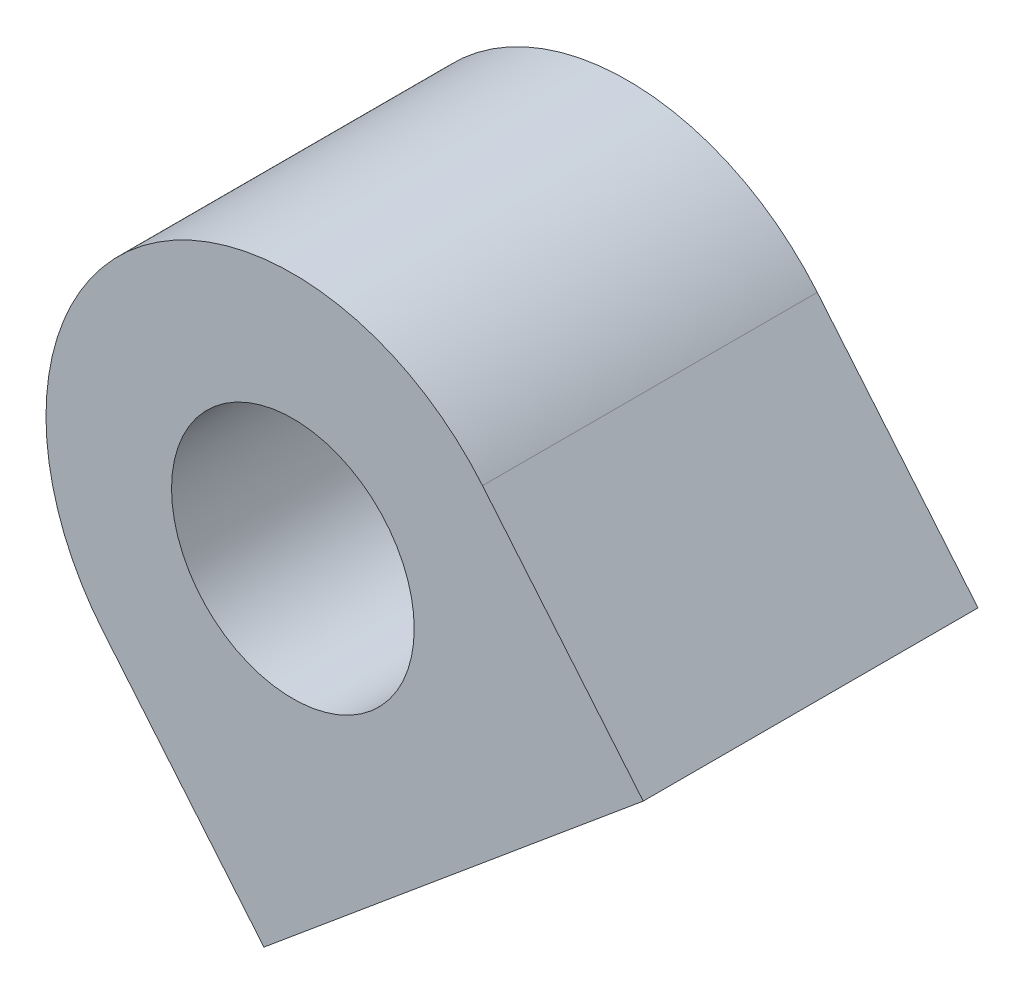
ISO-10303-21;
HEADER;
FILE_DESCRIPTION(('STEP AP214'),'2;1');
FILE_NAME('part.step','',(''),(''),'','','');
FILE_SCHEMA(('AUTOMOTIVE_DESIGN { 1 0 10303 214 1 1 1 1 }'));
ENDSEC;
DATA;
#1=APPLICATION_CONTEXT('core data for automotive mechanical design processes');
#2=APPLICATION_PROTOCOL_DEFINITION('international standard','automotive_design',2000,#1);
#3=PRODUCT_CONTEXT('',#1,'mechanical');
#4=PRODUCT('Part','Part','',(#3));
#5=PRODUCT_RELATED_PRODUCT_CATEGORY('part','',(#4));
#6=PRODUCT_DEFINITION_FORMATION('','',#4);
#7=PRODUCT_DEFINITION_CONTEXT('part definition',#1,'design');
#8=PRODUCT_DEFINITION('design','',#6,#7);
#9=PRODUCT_DEFINITION_SHAPE('','',#8);
#10=(LENGTH_UNIT() NAMED_UNIT(*) SI_UNIT(.MILLI.,.METRE.));
#11=(NAMED_UNIT(*) PLANE_ANGLE_UNIT() SI_UNIT($,.RADIAN.));
#12=(NAMED_UNIT(*) SI_UNIT($,.STERADIAN.) SOLID_ANGLE_UNIT());
#13=UNCERTAINTY_MEASURE_WITH_UNIT(LENGTH_MEASURE(1.E-05),#10,'distance_accuracy_value','');
#14=(GEOMETRIC_REPRESENTATION_CONTEXT(3) GLOBAL_UNCERTAINTY_ASSIGNED_CONTEXT((#13)) GLOBAL_UNIT_ASSIGNED_CONTEXT((#10,
#11,#12)) REPRESENTATION_CONTEXT('',''));
#15=CARTESIAN_POINT('',(0.,0.,0.));
#16=DIRECTION('',(0.,0.,1.));
#17=DIRECTION('',(1.,0.,0.));
#18=AXIS2_PLACEMENT_3D('',#15,#16,#17);
#19=CARTESIAN_POINT('',(0.,0.,5.));
#20=DIRECTION('',(0.,0.,-1.));
#21=DIRECTION('',(-1.,0.,0.));
#22=AXIS2_PLACEMENT_3D('',#19,#20,#21);
#23=PLANE('',#22);
#24=CARTESIAN_POINT('',(20.8115118330326,-31.5892582921046,5.));
#25=DIRECTION('',(0.,0.,-1.));
#26=DIRECTION('',(-1.,0.,0.));
#27=AXIS2_PLACEMENT_3D('',#24,#25,#26);
#28=CIRCLE('',#27,1.45);
#29=CARTESIAN_POINT('',(19.3615118330326,-31.5892582921046,5.));
#30=VERTEX_POINT('',#29);
#31=EDGE_CURVE('E44',#30,#30,#28,.T.);
#32=ORIENTED_EDGE('',*,*,#31,.T.);
#33=EDGE_LOOP('',(#32));
#34=FACE_BOUND('',#33,.T.);
#35=DIRECTION('',(0.640184399664478,-0.768221279597378,0.));
#36=VECTOR('',#35,1.);
#37=CARTESIAN_POINT('',(-5.51974986946737,-4.59979155788945,5.));
#38=LINE('',#37,#36);
#39=CARTESIAN_POINT('',(18.5452590582203,-33.4778022711149,5.));
#40=VERTEX_POINT('',#39);
#41=CARTESIAN_POINT('',(20.4658122572138,-35.782466109907,5.));
#42=VERTEX_POINT('',#41);
#43=EDGE_CURVE('E11',#40,#42,#38,.T.);
#44=ORIENTED_EDGE('',*,*,#43,.T.);
#45=DIRECTION('',(-0.768221279597376,-0.64018439966448,0.));
#46=VECTOR('',#45,1.);
#47=CARTESIAN_POINT('',(25.9855621266812,-31.1826745520174,5.));
#48=LINE('',#47,#46);
#49=CARTESIAN_POINT('',(24.9983178068383,-32.0053781518865,5.));
#50=VERTEX_POINT('',#49);
#51=EDGE_CURVE('E100',#50,#42,#48,.T.);
#52=ORIENTED_EDGE('',*,*,#51,.F.);
#53=DIRECTION('',(0.640184399664483,-0.768221279597373,0.));
#54=VECTOR('',#53,1.);
#55=CARTESIAN_POINT('',(-0.987244319843058,-0.822703599869222,5.));
#56=LINE('',#55,#54);
#57=CARTESIAN_POINT('',(23.0777646078448,-29.7007143130944,5.));
#58=VERTEX_POINT('',#57);
#59=EDGE_CURVE('E102',#58,#50,#56,.T.);
#60=ORIENTED_EDGE('',*,*,#59,.F.);
#61=CARTESIAN_POINT('',(20.8115118330326,-31.5892582921046,5.));
#62=DIRECTION('',(0.,0.,-1.));
#63=DIRECTION('',(-1.,0.,0.));
#64=AXIS2_PLACEMENT_3D('',#61,#62,#63);
#65=CIRCLE('',#64,2.95);
#66=EDGE_CURVE('E54',#40,#58,#65,.T.);
#67=ORIENTED_EDGE('',*,*,#66,.F.);
#68=EDGE_LOOP('',(#44,#52,#60,#67));
#69=FACE_BOUND('',#68,.T.);
#70=ADVANCED_FACE('F41',(#34,#69),#23,.F.);
#71=CARTESIAN_POINT('',(20.8115118330326,-31.5892582921046,1.));
#72=DIRECTION('',(0.,0.,1.));
#73=DIRECTION('',(1.,0.,0.));
#74=AXIS2_PLACEMENT_3D('',#71,#72,#73);
#75=CYLINDRICAL_SURFACE('',#74,2.95);
#76=DIRECTION('',(0.,0.,1.));
#77=VECTOR('',#76,1.);
#78=CARTESIAN_POINT('',(18.5452590582203,-33.4778022711149,1.));
#79=LINE('',#78,#77);
#80=CARTESIAN_POINT('',(18.5452590582203,-33.4778022711149,1.));
#81=VERTEX_POINT('',#80);
#82=EDGE_CURVE('E109',#81,#40,#79,.T.);
#83=ORIENTED_EDGE('',*,*,#82,.T.);
#84=ORIENTED_EDGE('',*,*,#66,.T.);
#85=DIRECTION('',(0.,0.,1.));
#86=VECTOR('',#85,1.);
#87=CARTESIAN_POINT('',(23.0777646078448,-29.7007143130944,1.));
#88=LINE('',#87,#86);
#89=CARTESIAN_POINT('',(23.0777646078448,-29.7007143130944,1.));
#90=VERTEX_POINT('',#89);
#91=EDGE_CURVE('E83',#90,#58,#88,.T.);
#92=ORIENTED_EDGE('',*,*,#91,.F.);
#93=CARTESIAN_POINT('',(20.8115118330326,-31.5892582921046,1.));
#94=DIRECTION('',(0.,0.,-1.));
#95=DIRECTION('',(-1.,0.,0.));
#96=AXIS2_PLACEMENT_3D('',#93,#94,#95);
#97=CIRCLE('',#96,2.95);
#98=EDGE_CURVE('E90',#81,#90,#97,.T.);
#99=ORIENTED_EDGE('',*,*,#98,.F.);
#100=EDGE_LOOP('',(#83,#84,#92,#99));
#101=FACE_BOUND('',#100,.T.);
#102=ADVANCED_FACE('F99',(#101),#75,.T.);
#103=CARTESIAN_POINT('',(0.,0.,1.));
#104=DIRECTION('',(0.,0.,-1.));
#105=DIRECTION('',(-1.,0.,0.));
#106=AXIS2_PLACEMENT_3D('',#103,#104,#105);
#107=PLANE('',#106);
#108=CARTESIAN_POINT('',(20.8115118330326,-31.5892582921046,1.));
#109=DIRECTION('',(0.,0.,-1.));
#110=DIRECTION('',(-1.,0.,0.));
#111=AXIS2_PLACEMENT_3D('',#108,#109,#110);
#112=CIRCLE('',#111,1.45);
#113=CARTESIAN_POINT('',(19.3615118330326,-31.5892582921046,1.));
#114=VERTEX_POINT('',#113);
#115=EDGE_CURVE('E97',#114,#114,#112,.T.);
#116=ORIENTED_EDGE('',*,*,#115,.F.);
#117=EDGE_LOOP('',(#116));
#118=FACE_BOUND('',#117,.T.);
#119=ORIENTED_EDGE('',*,*,#98,.T.);
#120=DIRECTION('',(0.640184399664483,-0.768221279597373,0.));
#121=VECTOR('',#120,1.);
#122=CARTESIAN_POINT('',(-0.987244319843058,-0.822703599869222,1.));
#123=LINE('',#122,#121);
#124=CARTESIAN_POINT('',(24.9983178068383,-32.0053781518865,1.));
#125=VERTEX_POINT('',#124);
#126=EDGE_CURVE('E80',#90,#125,#123,.T.);
#127=ORIENTED_EDGE('',*,*,#126,.T.);
#128=DIRECTION('',(0.768221279597376,0.64018439966448,0.));
#129=VECTOR('',#128,1.);
#130=CARTESIAN_POINT('',(25.9855621266812,-31.1826745520174,1.));
#131=LINE('',#130,#129);
#132=CARTESIAN_POINT('',(20.4658122572138,-35.782466109907,1.));
#133=VERTEX_POINT('',#132);
#134=EDGE_CURVE('E89',#133,#125,#131,.T.);
#135=ORIENTED_EDGE('',*,*,#134,.F.);
#136=DIRECTION('',(0.640184399664478,-0.768221279597378,0.));
#137=VECTOR('',#136,1.);
#138=CARTESIAN_POINT('',(-5.51974986946737,-4.59979155788945,1.));
#139=LINE('',#138,#137);
#140=EDGE_CURVE('E96',#81,#133,#139,.T.);
#141=ORIENTED_EDGE('',*,*,#140,.F.);
#142=EDGE_LOOP('',(#119,#127,#135,#141));
#143=FACE_BOUND('',#142,.T.);
#144=ADVANCED_FACE('F94',(#118,#143),#107,.T.);
#145=CARTESIAN_POINT('',(-5.51974986946737,-4.59979155788945,1.));
#146=DIRECTION('',(-0.768221279597378,-0.640184399664478,0.));
#147=DIRECTION('',(0.640184399664478,-0.768221279597378,0.));
#148=AXIS2_PLACEMENT_3D('',#145,#146,#147);
#149=PLANE('',#148);
#150=ORIENTED_EDGE('',*,*,#43,.F.);
#151=ORIENTED_EDGE('',*,*,#82,.F.);
#152=ORIENTED_EDGE('',*,*,#140,.T.);
#153=DIRECTION('',(0.,0.,1.));
#154=VECTOR('',#153,1.);
#155=CARTESIAN_POINT('',(20.4658122572138,-35.782466109907,1.));
#156=LINE('',#155,#154);
#157=EDGE_CURVE('E104',#133,#42,#156,.T.);
#158=ORIENTED_EDGE('',*,*,#157,.T.);
#159=EDGE_LOOP('',(#150,#151,#152,#158));
#160=FACE_BOUND('',#159,.T.);
#161=ADVANCED_FACE('F128',(#160),#149,.T.);
#162=CARTESIAN_POINT('',(-0.987244319843058,-0.822703599869222,1.));
#163=DIRECTION('',(-0.768221279597373,-0.640184399664483,0.));
#164=DIRECTION('',(0.640184399664483,-0.768221279597373,0.));
#165=AXIS2_PLACEMENT_3D('',#162,#163,#164);
#166=PLANE('',#165);
#167=ORIENTED_EDGE('',*,*,#91,.T.);
#168=ORIENTED_EDGE('',*,*,#59,.T.);
#169=DIRECTION('',(0.,0.,1.));
#170=VECTOR('',#169,1.);
#171=CARTESIAN_POINT('',(24.9983178068383,-32.0053781518865,1.));
#172=LINE('',#171,#170);
#173=EDGE_CURVE('E85',#125,#50,#172,.T.);
#174=ORIENTED_EDGE('',*,*,#173,.F.);
#175=ORIENTED_EDGE('',*,*,#126,.F.);
#176=EDGE_LOOP('',(#167,#168,#174,#175));
#177=FACE_BOUND('',#176,.T.);
#178=ADVANCED_FACE('F82',(#177),#166,.F.);
#179=CARTESIAN_POINT('',(25.9855621266812,-31.1826745520174,1.));
#180=DIRECTION('',(0.64018439966448,-0.768221279597376,0.));
#181=DIRECTION('',(0.768221279597376,0.64018439966448,0.));
#182=AXIS2_PLACEMENT_3D('',#179,#180,#181);
#183=PLANE('',#182);
#184=ORIENTED_EDGE('',*,*,#173,.T.);
#185=ORIENTED_EDGE('',*,*,#51,.T.);
#186=ORIENTED_EDGE('',*,*,#157,.F.);
#187=ORIENTED_EDGE('',*,*,#134,.T.);
#188=EDGE_LOOP('',(#184,#185,#186,#187));
#189=FACE_BOUND('',#188,.T.);
#190=ADVANCED_FACE('F123',(#189),#183,.T.);
#191=CARTESIAN_POINT('',(20.8115118330326,-31.5892582921046,1.));
#192=DIRECTION('',(0.,0.,1.));
#193=DIRECTION('',(1.,0.,0.));
#194=AXIS2_PLACEMENT_3D('',#191,#192,#193);
#195=CYLINDRICAL_SURFACE('',#194,1.45);
#196=ORIENTED_EDGE('',*,*,#31,.F.);
#197=EDGE_LOOP('',(#196));
#198=FACE_BOUND('',#197,.T.);
#199=ORIENTED_EDGE('',*,*,#115,.T.);
#200=EDGE_LOOP('',(#199));
#201=FACE_BOUND('',#200,.T.);
#202=ADVANCED_FACE('F120',(#198,#201),#195,.F.);
#203=CLOSED_SHELL('',(#70,#102,#144,#161,#178,#190,#202));
#204=MANIFOLD_SOLID_BREP('B2',#203);
#205=ADVANCED_BREP_SHAPE_REPRESENTATION('',(#18,#204),#14);
#206=SHAPE_DEFINITION_REPRESENTATION(#9,#205);
ENDSEC;
END-ISO-10303-21;
